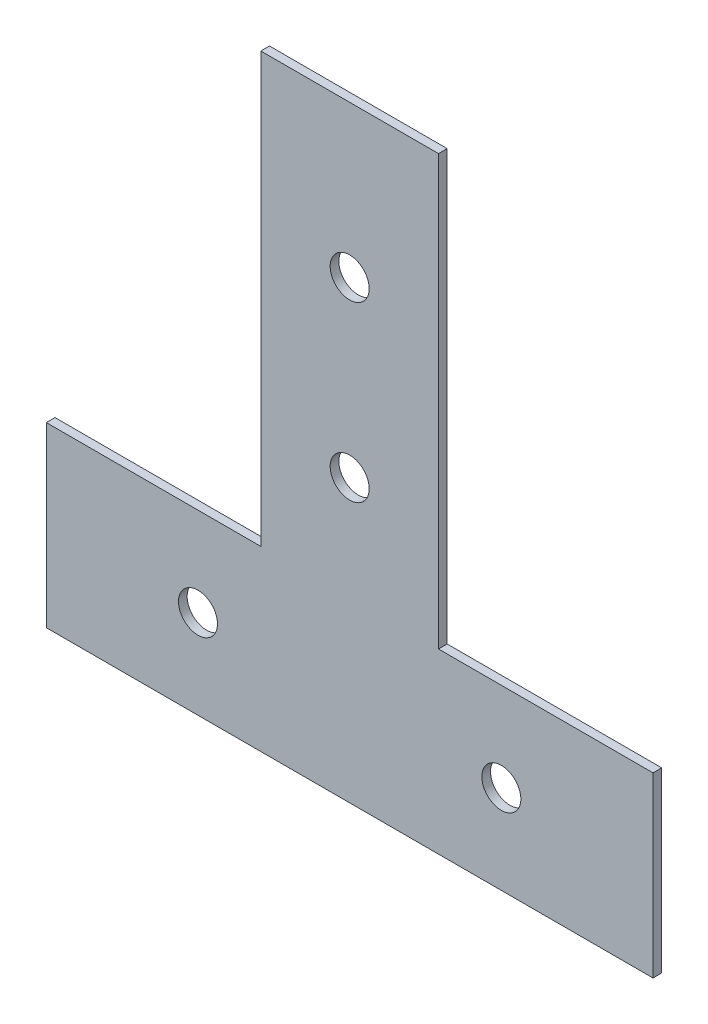
ISO-10303-21;
HEADER;
FILE_DESCRIPTION(('STEP AP214'),'2;1');
FILE_NAME('part.step','',(''),(''),'','','');
FILE_SCHEMA(('AUTOMOTIVE_DESIGN { 1 0 10303 214 1 1 1 1 }'));
ENDSEC;
DATA;
#1=APPLICATION_CONTEXT('core data for automotive mechanical design processes');
#2=APPLICATION_PROTOCOL_DEFINITION('international standard','automotive_design',2000,#1);
#3=PRODUCT_CONTEXT('',#1,'mechanical');
#4=PRODUCT('Part','Part','',(#3));
#5=PRODUCT_RELATED_PRODUCT_CATEGORY('part','',(#4));
#6=PRODUCT_DEFINITION_FORMATION('','',#4);
#7=PRODUCT_DEFINITION_CONTEXT('part definition',#1,'design');
#8=PRODUCT_DEFINITION('design','',#6,#7);
#9=PRODUCT_DEFINITION_SHAPE('','',#8);
#10=(LENGTH_UNIT() NAMED_UNIT(*) SI_UNIT(.MILLI.,.METRE.));
#11=(NAMED_UNIT(*) PLANE_ANGLE_UNIT() SI_UNIT($,.RADIAN.));
#12=(NAMED_UNIT(*) SI_UNIT($,.STERADIAN.) SOLID_ANGLE_UNIT());
#13=UNCERTAINTY_MEASURE_WITH_UNIT(LENGTH_MEASURE(1.E-05),#10,'distance_accuracy_value','');
#14=(GEOMETRIC_REPRESENTATION_CONTEXT(3) GLOBAL_UNCERTAINTY_ASSIGNED_CONTEXT((#13)) GLOBAL_UNIT_ASSIGNED_CONTEXT((#10,
#11,#12)) REPRESENTATION_CONTEXT('',''));
#15=CARTESIAN_POINT('',(0.,0.,0.));
#16=DIRECTION('',(0.,0.,1.));
#17=DIRECTION('',(1.,0.,0.));
#18=AXIS2_PLACEMENT_3D('',#15,#16,#17);
#19=CARTESIAN_POINT('',(20.5,20.5,2.));
#20=DIRECTION('',(0.,-1.,0.));
#21=DIRECTION('',(0.,0.,-1.));
#22=AXIS2_PLACEMENT_3D('',#19,#20,#21);
#23=PLANE('',#22);
#24=DIRECTION('',(-1.,0.,0.));
#25=VECTOR('',#24,1.);
#26=CARTESIAN_POINT('',(20.5,20.5,0.));
#27=LINE('',#26,#25);
#28=CARTESIAN_POINT('',(70.,20.5,0.));
#29=VERTEX_POINT('',#28);
#30=CARTESIAN_POINT('',(20.5,20.5,0.));
#31=VERTEX_POINT('',#30);
#32=EDGE_CURVE('E129',#29,#31,#27,.T.);
#33=ORIENTED_EDGE('',*,*,#32,.T.);
#34=DIRECTION('',(0.,0.,-1.));
#35=VECTOR('',#34,1.);
#36=CARTESIAN_POINT('',(20.5,20.5,2.));
#37=LINE('',#36,#35);
#38=CARTESIAN_POINT('',(20.5,20.5,2.));
#39=VERTEX_POINT('',#38);
#40=EDGE_CURVE('E11',#39,#31,#37,.T.);
#41=ORIENTED_EDGE('',*,*,#40,.F.);
#42=DIRECTION('',(-1.,0.,0.));
#43=VECTOR('',#42,1.);
#44=CARTESIAN_POINT('',(20.5,20.5,2.));
#45=LINE('',#44,#43);
#46=CARTESIAN_POINT('',(70.,20.5,2.));
#47=VERTEX_POINT('',#46);
#48=EDGE_CURVE('E144',#47,#39,#45,.T.);
#49=ORIENTED_EDGE('',*,*,#48,.F.);
#50=DIRECTION('',(0.,0.,-1.));
#51=VECTOR('',#50,1.);
#52=CARTESIAN_POINT('',(70.,20.5,2.));
#53=LINE('',#52,#51);
#54=EDGE_CURVE('E125',#47,#29,#53,.T.);
#55=ORIENTED_EDGE('',*,*,#54,.T.);
#56=EDGE_LOOP('',(#33,#41,#49,#55));
#57=FACE_BOUND('',#56,.T.);
#58=ADVANCED_FACE('F33',(#57),#23,.F.);
#59=CARTESIAN_POINT('',(20.5,20.5,2.));
#60=DIRECTION('',(-1.,0.,0.));
#61=DIRECTION('',(0.,0.,1.));
#62=AXIS2_PLACEMENT_3D('',#59,#60,#61);
#63=PLANE('',#62);
#64=DIRECTION('',(0.,1.,0.));
#65=VECTOR('',#64,1.);
#66=CARTESIAN_POINT('',(20.5,20.5,0.));
#67=LINE('',#66,#65);
#68=CARTESIAN_POINT('',(20.5,119.5,0.));
#69=VERTEX_POINT('',#68);
#70=EDGE_CURVE('E132',#31,#69,#67,.T.);
#71=ORIENTED_EDGE('',*,*,#70,.T.);
#72=DIRECTION('',(0.,0.,-1.));
#73=VECTOR('',#72,1.);
#74=CARTESIAN_POINT('',(20.5,119.5,2.));
#75=LINE('',#74,#73);
#76=CARTESIAN_POINT('',(20.5,119.5,2.));
#77=VERTEX_POINT('',#76);
#78=EDGE_CURVE('E41',#77,#69,#75,.T.);
#79=ORIENTED_EDGE('',*,*,#78,.F.);
#80=DIRECTION('',(0.,1.,0.));
#81=VECTOR('',#80,1.);
#82=CARTESIAN_POINT('',(20.5,20.5,2.));
#83=LINE('',#82,#81);
#84=EDGE_CURVE('E92',#39,#77,#83,.T.);
#85=ORIENTED_EDGE('',*,*,#84,.F.);
#86=ORIENTED_EDGE('',*,*,#40,.T.);
#87=EDGE_LOOP('',(#71,#79,#85,#86));
#88=FACE_BOUND('',#87,.T.);
#89=ADVANCED_FACE('F234',(#88),#63,.F.);
#90=CARTESIAN_POINT('',(-20.5,119.5,2.));
#91=DIRECTION('',(0.,-1.,0.));
#92=DIRECTION('',(0.,0.,-1.));
#93=AXIS2_PLACEMENT_3D('',#90,#91,#92);
#94=PLANE('',#93);
#95=DIRECTION('',(-1.,0.,0.));
#96=VECTOR('',#95,1.);
#97=CARTESIAN_POINT('',(-20.5,119.5,0.));
#98=LINE('',#97,#96);
#99=CARTESIAN_POINT('',(-20.5,119.5,0.));
#100=VERTEX_POINT('',#99);
#101=EDGE_CURVE('E135',#69,#100,#98,.T.);
#102=ORIENTED_EDGE('',*,*,#101,.T.);
#103=DIRECTION('',(0.,0.,-1.));
#104=VECTOR('',#103,1.);
#105=CARTESIAN_POINT('',(-20.5,119.5,2.));
#106=LINE('',#105,#104);
#107=CARTESIAN_POINT('',(-20.5,119.5,2.));
#108=VERTEX_POINT('',#107);
#109=EDGE_CURVE('E151',#108,#100,#106,.T.);
#110=ORIENTED_EDGE('',*,*,#109,.F.);
#111=DIRECTION('',(-1.,0.,0.));
#112=VECTOR('',#111,1.);
#113=CARTESIAN_POINT('',(-20.5,119.5,2.));
#114=LINE('',#113,#112);
#115=EDGE_CURVE('E159',#77,#108,#114,.T.);
#116=ORIENTED_EDGE('',*,*,#115,.F.);
#117=ORIENTED_EDGE('',*,*,#78,.T.);
#118=EDGE_LOOP('',(#102,#110,#116,#117));
#119=FACE_BOUND('',#118,.T.);
#120=ADVANCED_FACE('F157',(#119),#94,.F.);
#121=CARTESIAN_POINT('',(-20.5,20.5,2.));
#122=DIRECTION('',(1.,0.,0.));
#123=DIRECTION('',(0.,0.,-1.));
#124=AXIS2_PLACEMENT_3D('',#121,#122,#123);
#125=PLANE('',#124);
#126=DIRECTION('',(0.,-1.,0.));
#127=VECTOR('',#126,1.);
#128=CARTESIAN_POINT('',(-20.5,20.5,0.));
#129=LINE('',#128,#127);
#130=CARTESIAN_POINT('',(-20.5,20.5,0.));
#131=VERTEX_POINT('',#130);
#132=EDGE_CURVE('E137',#100,#131,#129,.T.);
#133=ORIENTED_EDGE('',*,*,#132,.T.);
#134=DIRECTION('',(0.,0.,-1.));
#135=VECTOR('',#134,1.);
#136=CARTESIAN_POINT('',(-20.5,20.5,2.));
#137=LINE('',#136,#135);
#138=CARTESIAN_POINT('',(-20.5,20.5,2.));
#139=VERTEX_POINT('',#138);
#140=EDGE_CURVE('E148',#139,#131,#137,.T.);
#141=ORIENTED_EDGE('',*,*,#140,.F.);
#142=DIRECTION('',(0.,-1.,0.));
#143=VECTOR('',#142,1.);
#144=CARTESIAN_POINT('',(-20.5,20.5,2.));
#145=LINE('',#144,#143);
#146=EDGE_CURVE('E171',#108,#139,#145,.T.);
#147=ORIENTED_EDGE('',*,*,#146,.F.);
#148=ORIENTED_EDGE('',*,*,#109,.T.);
#149=EDGE_LOOP('',(#133,#141,#147,#148));
#150=FACE_BOUND('',#149,.T.);
#151=ADVANCED_FACE('F167',(#150),#125,.F.);
#152=CARTESIAN_POINT('',(-70.,20.5,2.));
#153=DIRECTION('',(0.,-1.,0.));
#154=DIRECTION('',(0.,0.,-1.));
#155=AXIS2_PLACEMENT_3D('',#152,#153,#154);
#156=PLANE('',#155);
#157=DIRECTION('',(-1.,0.,0.));
#158=VECTOR('',#157,1.);
#159=CARTESIAN_POINT('',(-70.,20.5,0.));
#160=LINE('',#159,#158);
#161=CARTESIAN_POINT('',(-70.,20.5,0.));
#162=VERTEX_POINT('',#161);
#163=EDGE_CURVE('E139',#131,#162,#160,.T.);
#164=ORIENTED_EDGE('',*,*,#163,.T.);
#165=DIRECTION('',(0.,0.,-1.));
#166=VECTOR('',#165,1.);
#167=CARTESIAN_POINT('',(-70.,20.5,2.));
#168=LINE('',#167,#166);
#169=CARTESIAN_POINT('',(-70.,20.5,2.));
#170=VERTEX_POINT('',#169);
#171=EDGE_CURVE('E120',#170,#162,#168,.T.);
#172=ORIENTED_EDGE('',*,*,#171,.F.);
#173=DIRECTION('',(-1.,0.,0.));
#174=VECTOR('',#173,1.);
#175=CARTESIAN_POINT('',(-70.,20.5,2.));
#176=LINE('',#175,#174);
#177=EDGE_CURVE('E111',#139,#170,#176,.T.);
#178=ORIENTED_EDGE('',*,*,#177,.F.);
#179=ORIENTED_EDGE('',*,*,#140,.T.);
#180=EDGE_LOOP('',(#164,#172,#178,#179));
#181=FACE_BOUND('',#180,.T.);
#182=ADVANCED_FACE('F170',(#181),#156,.F.);
#183=CARTESIAN_POINT('',(-70.,-20.5,2.));
#184=DIRECTION('',(1.,0.,0.));
#185=DIRECTION('',(0.,0.,-1.));
#186=AXIS2_PLACEMENT_3D('',#183,#184,#185);
#187=PLANE('',#186);
#188=DIRECTION('',(0.,-1.,0.));
#189=VECTOR('',#188,1.);
#190=CARTESIAN_POINT('',(-70.,-20.5,0.));
#191=LINE('',#190,#189);
#192=CARTESIAN_POINT('',(-70.,-20.5,0.));
#193=VERTEX_POINT('',#192);
#194=EDGE_CURVE('E119',#162,#193,#191,.T.);
#195=ORIENTED_EDGE('',*,*,#194,.T.);
#196=DIRECTION('',(0.,0.,-1.));
#197=VECTOR('',#196,1.);
#198=CARTESIAN_POINT('',(-70.,-20.5,2.));
#199=LINE('',#198,#197);
#200=CARTESIAN_POINT('',(-70.,-20.5,2.));
#201=VERTEX_POINT('',#200);
#202=EDGE_CURVE('E116',#201,#193,#199,.T.);
#203=ORIENTED_EDGE('',*,*,#202,.F.);
#204=DIRECTION('',(0.,-1.,0.));
#205=VECTOR('',#204,1.);
#206=CARTESIAN_POINT('',(-70.,-20.5,2.));
#207=LINE('',#206,#205);
#208=EDGE_CURVE('E105',#170,#201,#207,.T.);
#209=ORIENTED_EDGE('',*,*,#208,.F.);
#210=ORIENTED_EDGE('',*,*,#171,.T.);
#211=EDGE_LOOP('',(#195,#203,#209,#210));
#212=FACE_BOUND('',#211,.T.);
#213=ADVANCED_FACE('F117',(#212),#187,.F.);
#214=CARTESIAN_POINT('',(-70.,-20.5,2.));
#215=DIRECTION('',(0.,1.,0.));
#216=DIRECTION('',(0.,0.,1.));
#217=AXIS2_PLACEMENT_3D('',#214,#215,#216);
#218=PLANE('',#217);
#219=DIRECTION('',(1.,0.,0.));
#220=VECTOR('',#219,1.);
#221=CARTESIAN_POINT('',(-70.,-20.5,0.));
#222=LINE('',#221,#220);
#223=CARTESIAN_POINT('',(70.,-20.5,0.));
#224=VERTEX_POINT('',#223);
#225=EDGE_CURVE('E78',#193,#224,#222,.T.);
#226=ORIENTED_EDGE('',*,*,#225,.T.);
#227=DIRECTION('',(0.,0.,-1.));
#228=VECTOR('',#227,1.);
#229=CARTESIAN_POINT('',(70.,-20.5,2.));
#230=LINE('',#229,#228);
#231=CARTESIAN_POINT('',(70.,-20.5,2.));
#232=VERTEX_POINT('',#231);
#233=EDGE_CURVE('E121',#232,#224,#230,.T.);
#234=ORIENTED_EDGE('',*,*,#233,.F.);
#235=DIRECTION('',(1.,0.,0.));
#236=VECTOR('',#235,1.);
#237=CARTESIAN_POINT('',(-70.,-20.5,2.));
#238=LINE('',#237,#236);
#239=EDGE_CURVE('E109',#201,#232,#238,.T.);
#240=ORIENTED_EDGE('',*,*,#239,.F.);
#241=ORIENTED_EDGE('',*,*,#202,.T.);
#242=EDGE_LOOP('',(#226,#234,#240,#241));
#243=FACE_BOUND('',#242,.T.);
#244=ADVANCED_FACE('F123',(#243),#218,.F.);
#245=CARTESIAN_POINT('',(70.,-20.5,2.));
#246=DIRECTION('',(-1.,0.,0.));
#247=DIRECTION('',(0.,0.,1.));
#248=AXIS2_PLACEMENT_3D('',#245,#246,#247);
#249=PLANE('',#248);
#250=DIRECTION('',(0.,1.,0.));
#251=VECTOR('',#250,1.);
#252=CARTESIAN_POINT('',(70.,-20.5,0.));
#253=LINE('',#252,#251);
#254=EDGE_CURVE('E84',#224,#29,#253,.T.);
#255=ORIENTED_EDGE('',*,*,#254,.T.);
#256=ORIENTED_EDGE('',*,*,#54,.F.);
#257=DIRECTION('',(0.,1.,0.));
#258=VECTOR('',#257,1.);
#259=CARTESIAN_POINT('',(70.,-20.5,2.));
#260=LINE('',#259,#258);
#261=EDGE_CURVE('E49',#232,#47,#260,.T.);
#262=ORIENTED_EDGE('',*,*,#261,.F.);
#263=ORIENTED_EDGE('',*,*,#233,.T.);
#264=EDGE_LOOP('',(#255,#256,#262,#263));
#265=FACE_BOUND('',#264,.T.);
#266=ADVANCED_FACE('F212',(#265),#249,.F.);
#267=CARTESIAN_POINT('',(70.,20.5,2.));
#268=DIRECTION('',(0.,0.,1.));
#269=DIRECTION('',(1.,0.,0.));
#270=AXIS2_PLACEMENT_3D('',#267,#268,#269);
#271=PLANE('',#270);
#272=CARTESIAN_POINT('',(35.,0.,2.));
#273=DIRECTION('',(0.,0.,1.));
#274=DIRECTION('',(-1.,0.,0.));
#275=AXIS2_PLACEMENT_3D('',#272,#273,#274);
#276=CIRCLE('',#275,4.5);
#277=CARTESIAN_POINT('',(30.5,0.,2.));
#278=VERTEX_POINT('',#277);
#279=EDGE_CURVE('E195',#278,#278,#276,.T.);
#280=ORIENTED_EDGE('',*,*,#279,.F.);
#281=EDGE_LOOP('',(#280));
#282=FACE_BOUND('',#281,.T.);
#283=CARTESIAN_POINT('',(-35.,0.,2.));
#284=DIRECTION('',(0.,0.,1.));
#285=DIRECTION('',(1.,0.,0.));
#286=AXIS2_PLACEMENT_3D('',#283,#284,#285);
#287=CIRCLE('',#286,4.5);
#288=CARTESIAN_POINT('',(-30.5,0.,2.));
#289=VERTEX_POINT('',#288);
#290=EDGE_CURVE('E189',#289,#289,#287,.T.);
#291=ORIENTED_EDGE('',*,*,#290,.F.);
#292=EDGE_LOOP('',(#291));
#293=FACE_BOUND('',#292,.T.);
#294=CARTESIAN_POINT('',(0.,44.5,2.));
#295=DIRECTION('',(0.,0.,1.));
#296=DIRECTION('',(1.,0.,0.));
#297=AXIS2_PLACEMENT_3D('',#294,#295,#296);
#298=CIRCLE('',#297,4.5);
#299=CARTESIAN_POINT('',(4.5,44.5,2.));
#300=VERTEX_POINT('',#299);
#301=EDGE_CURVE('E183',#300,#300,#298,.T.);
#302=ORIENTED_EDGE('',*,*,#301,.F.);
#303=EDGE_LOOP('',(#302));
#304=FACE_BOUND('',#303,.T.);
#305=CARTESIAN_POINT('',(0.,84.5,2.));
#306=DIRECTION('',(0.,0.,1.));
#307=DIRECTION('',(1.,0.,0.));
#308=AXIS2_PLACEMENT_3D('',#305,#306,#307);
#309=CIRCLE('',#308,4.5);
#310=CARTESIAN_POINT('',(4.5,84.5,2.));
#311=VERTEX_POINT('',#310);
#312=EDGE_CURVE('E177',#311,#311,#309,.T.);
#313=ORIENTED_EDGE('',*,*,#312,.F.);
#314=EDGE_LOOP('',(#313));
#315=FACE_BOUND('',#314,.T.);
#316=ORIENTED_EDGE('',*,*,#48,.T.);
#317=ORIENTED_EDGE('',*,*,#84,.T.);
#318=ORIENTED_EDGE('',*,*,#115,.T.);
#319=ORIENTED_EDGE('',*,*,#146,.T.);
#320=ORIENTED_EDGE('',*,*,#177,.T.);
#321=ORIENTED_EDGE('',*,*,#208,.T.);
#322=ORIENTED_EDGE('',*,*,#239,.T.);
#323=ORIENTED_EDGE('',*,*,#261,.T.);
#324=EDGE_LOOP('',(#316,#317,#318,#319,#320,#321,#322,#323));
#325=FACE_BOUND('',#324,.T.);
#326=ADVANCED_FACE('F107',(#282,#293,#304,#315,#325),#271,.T.);
#327=CARTESIAN_POINT('',(70.,20.5,0.));
#328=DIRECTION('',(0.,0.,1.));
#329=DIRECTION('',(1.,0.,0.));
#330=AXIS2_PLACEMENT_3D('',#327,#328,#329);
#331=PLANE('',#330);
#332=CARTESIAN_POINT('',(35.,0.,0.));
#333=DIRECTION('',(0.,0.,1.));
#334=DIRECTION('',(-1.,0.,0.));
#335=AXIS2_PLACEMENT_3D('',#332,#333,#334);
#336=CIRCLE('',#335,4.5);
#337=CARTESIAN_POINT('',(30.5,0.,0.));
#338=VERTEX_POINT('',#337);
#339=EDGE_CURVE('E192',#338,#338,#336,.T.);
#340=ORIENTED_EDGE('',*,*,#339,.T.);
#341=EDGE_LOOP('',(#340));
#342=FACE_BOUND('',#341,.T.);
#343=CARTESIAN_POINT('',(-35.,0.,0.));
#344=DIRECTION('',(0.,0.,1.));
#345=DIRECTION('',(1.,0.,0.));
#346=AXIS2_PLACEMENT_3D('',#343,#344,#345);
#347=CIRCLE('',#346,4.5);
#348=CARTESIAN_POINT('',(-30.5,0.,0.));
#349=VERTEX_POINT('',#348);
#350=EDGE_CURVE('E186',#349,#349,#347,.T.);
#351=ORIENTED_EDGE('',*,*,#350,.T.);
#352=EDGE_LOOP('',(#351));
#353=FACE_BOUND('',#352,.T.);
#354=CARTESIAN_POINT('',(0.,44.5,0.));
#355=DIRECTION('',(0.,0.,1.));
#356=DIRECTION('',(1.,0.,0.));
#357=AXIS2_PLACEMENT_3D('',#354,#355,#356);
#358=CIRCLE('',#357,4.5);
#359=CARTESIAN_POINT('',(4.5,44.5,0.));
#360=VERTEX_POINT('',#359);
#361=EDGE_CURVE('E180',#360,#360,#358,.T.);
#362=ORIENTED_EDGE('',*,*,#361,.T.);
#363=EDGE_LOOP('',(#362));
#364=FACE_BOUND('',#363,.T.);
#365=CARTESIAN_POINT('',(0.,84.5,0.));
#366=DIRECTION('',(0.,0.,1.));
#367=DIRECTION('',(1.,0.,0.));
#368=AXIS2_PLACEMENT_3D('',#365,#366,#367);
#369=CIRCLE('',#368,4.5);
#370=CARTESIAN_POINT('',(4.5,84.5,0.));
#371=VERTEX_POINT('',#370);
#372=EDGE_CURVE('E133',#371,#371,#369,.T.);
#373=ORIENTED_EDGE('',*,*,#372,.T.);
#374=EDGE_LOOP('',(#373));
#375=FACE_BOUND('',#374,.T.);
#376=ORIENTED_EDGE('',*,*,#32,.F.);
#377=ORIENTED_EDGE('',*,*,#254,.F.);
#378=ORIENTED_EDGE('',*,*,#225,.F.);
#379=ORIENTED_EDGE('',*,*,#194,.F.);
#380=ORIENTED_EDGE('',*,*,#163,.F.);
#381=ORIENTED_EDGE('',*,*,#132,.F.);
#382=ORIENTED_EDGE('',*,*,#101,.F.);
#383=ORIENTED_EDGE('',*,*,#70,.F.);
#384=EDGE_LOOP('',(#376,#377,#378,#379,#380,#381,#382,#383));
#385=FACE_BOUND('',#384,.T.);
#386=ADVANCED_FACE('F163',(#342,#353,#364,#375,#385),#331,.F.);
#387=CARTESIAN_POINT('',(0.,84.5,0.));
#388=DIRECTION('',(0.,0.,1.));
#389=DIRECTION('',(1.,0.,0.));
#390=AXIS2_PLACEMENT_3D('',#387,#388,#389);
#391=CYLINDRICAL_SURFACE('',#390,4.5);
#392=ORIENTED_EDGE('',*,*,#372,.F.);
#393=EDGE_LOOP('',(#392));
#394=FACE_BOUND('',#393,.T.);
#395=ORIENTED_EDGE('',*,*,#312,.T.);
#396=EDGE_LOOP('',(#395));
#397=FACE_BOUND('',#396,.T.);
#398=ADVANCED_FACE('F220',(#394,#397),#391,.F.);
#399=CARTESIAN_POINT('',(0.,44.5,0.));
#400=DIRECTION('',(0.,0.,1.));
#401=DIRECTION('',(1.,0.,0.));
#402=AXIS2_PLACEMENT_3D('',#399,#400,#401);
#403=CYLINDRICAL_SURFACE('',#402,4.5);
#404=ORIENTED_EDGE('',*,*,#361,.F.);
#405=EDGE_LOOP('',(#404));
#406=FACE_BOUND('',#405,.T.);
#407=ORIENTED_EDGE('',*,*,#301,.T.);
#408=EDGE_LOOP('',(#407));
#409=FACE_BOUND('',#408,.T.);
#410=ADVANCED_FACE('F222',(#406,#409),#403,.F.);
#411=CARTESIAN_POINT('',(-35.,0.,0.));
#412=DIRECTION('',(0.,0.,1.));
#413=DIRECTION('',(1.,0.,0.));
#414=AXIS2_PLACEMENT_3D('',#411,#412,#413);
#415=CYLINDRICAL_SURFACE('',#414,4.5);
#416=ORIENTED_EDGE('',*,*,#350,.F.);
#417=EDGE_LOOP('',(#416));
#418=FACE_BOUND('',#417,.T.);
#419=ORIENTED_EDGE('',*,*,#290,.T.);
#420=EDGE_LOOP('',(#419));
#421=FACE_BOUND('',#420,.T.);
#422=ADVANCED_FACE('F206',(#418,#421),#415,.F.);
#423=CARTESIAN_POINT('',(35.,0.,0.));
#424=DIRECTION('',(0.,0.,1.));
#425=DIRECTION('',(1.,0.,0.));
#426=AXIS2_PLACEMENT_3D('',#423,#424,#425);
#427=CYLINDRICAL_SURFACE('',#426,4.5);
#428=ORIENTED_EDGE('',*,*,#339,.F.);
#429=EDGE_LOOP('',(#428));
#430=FACE_BOUND('',#429,.T.);
#431=ORIENTED_EDGE('',*,*,#279,.T.);
#432=EDGE_LOOP('',(#431));
#433=FACE_BOUND('',#432,.T.);
#434=ADVANCED_FACE('F203',(#430,#433),#427,.F.);
#435=CLOSED_SHELL('',(#58,#89,#120,#151,#182,#213,#244,#266,#326,#386,#398,#410,#422,#434));
#436=MANIFOLD_SOLID_BREP('B2',#435);
#437=ADVANCED_BREP_SHAPE_REPRESENTATION('',(#18,#436),#14);
#438=SHAPE_DEFINITION_REPRESENTATION(#9,#437);
ENDSEC;
END-ISO-10303-21;
